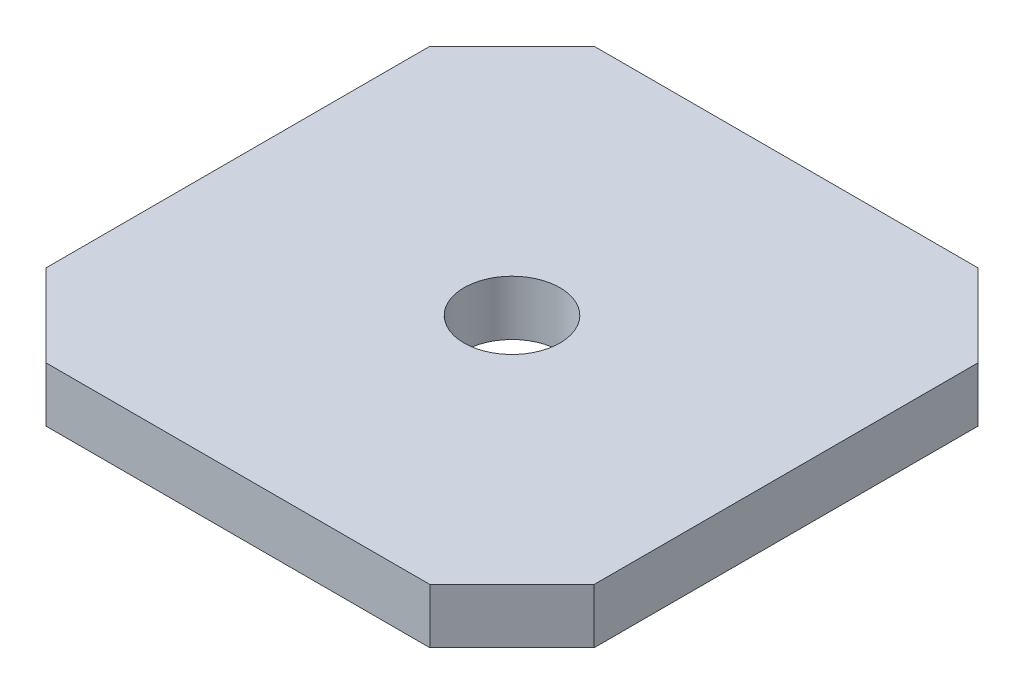
ISO-10303-21;
HEADER;
FILE_DESCRIPTION(('STEP AP214'),'2;1');
FILE_NAME('part.step','',(''),(''),'','','');
FILE_SCHEMA(('AUTOMOTIVE_DESIGN { 1 0 10303 214 1 1 1 1 }'));
ENDSEC;
DATA;
#1=APPLICATION_CONTEXT('core data for automotive mechanical design processes');
#2=APPLICATION_PROTOCOL_DEFINITION('international standard','automotive_design',2000,#1);
#3=PRODUCT_CONTEXT('',#1,'mechanical');
#4=PRODUCT('Part','Part','',(#3));
#5=PRODUCT_RELATED_PRODUCT_CATEGORY('part','',(#4));
#6=PRODUCT_DEFINITION_FORMATION('','',#4);
#7=PRODUCT_DEFINITION_CONTEXT('part definition',#1,'design');
#8=PRODUCT_DEFINITION('design','',#6,#7);
#9=PRODUCT_DEFINITION_SHAPE('','',#8);
#10=(LENGTH_UNIT() NAMED_UNIT(*) SI_UNIT(.MILLI.,.METRE.));
#11=(NAMED_UNIT(*) PLANE_ANGLE_UNIT() SI_UNIT($,.RADIAN.));
#12=(NAMED_UNIT(*) SI_UNIT($,.STERADIAN.) SOLID_ANGLE_UNIT());
#13=UNCERTAINTY_MEASURE_WITH_UNIT(LENGTH_MEASURE(1.E-05),#10,'distance_accuracy_value','');
#14=(GEOMETRIC_REPRESENTATION_CONTEXT(3) GLOBAL_UNCERTAINTY_ASSIGNED_CONTEXT((#13)) GLOBAL_UNIT_ASSIGNED_CONTEXT((#10,
#11,#12)) REPRESENTATION_CONTEXT('',''));
#15=CARTESIAN_POINT('',(0.,0.,0.));
#16=DIRECTION('',(0.,0.,1.));
#17=DIRECTION('',(1.,0.,0.));
#18=AXIS2_PLACEMENT_3D('',#15,#16,#17);
#19=CARTESIAN_POINT('',(0.,2.,0.));
#20=DIRECTION('',(0.,1.,0.));
#21=DIRECTION('',(0.,0.,1.));
#22=AXIS2_PLACEMENT_3D('',#19,#20,#21);
#23=PLANE('',#22);
#24=DIRECTION('',(-1.,0.,0.));
#25=VECTOR('',#24,1.);
#26=CARTESIAN_POINT('',(-10.,2.,-10.));
#27=LINE('',#26,#25);
#28=CARTESIAN_POINT('',(7.,2.,-10.));
#29=VERTEX_POINT('',#28);
#30=CARTESIAN_POINT('',(-7.,2.,-10.));
#31=VERTEX_POINT('',#30);
#32=EDGE_CURVE('E137',#29,#31,#27,.T.);
#33=ORIENTED_EDGE('',*,*,#32,.T.);
#34=DIRECTION('',(0.707106781186549,0.,-0.707106781186546));
#35=VECTOR('',#34,1.);
#36=CARTESIAN_POINT('',(-8.49999999999999,2.,-8.50000000000001));
#37=LINE('',#36,#35);
#38=CARTESIAN_POINT('',(-10.,2.,-7.));
#39=VERTEX_POINT('',#38);
#40=EDGE_CURVE('E156',#31,#39,#37,.F.);
#41=ORIENTED_EDGE('',*,*,#40,.T.);
#42=DIRECTION('',(0.,0.,1.));
#43=VECTOR('',#42,1.);
#44=CARTESIAN_POINT('',(-10.,2.,-10.));
#45=LINE('',#44,#43);
#46=CARTESIAN_POINT('',(-10.,2.,6.99999999999999));
#47=VERTEX_POINT('',#46);
#48=EDGE_CURVE('E120',#39,#47,#45,.T.);
#49=ORIENTED_EDGE('',*,*,#48,.T.);
#50=DIRECTION('',(-0.707106781186546,0.,-0.707106781186549));
#51=VECTOR('',#50,1.);
#52=CARTESIAN_POINT('',(-8.50000000000001,2.,8.49999999999999));
#53=LINE('',#52,#51);
#54=CARTESIAN_POINT('',(-7.,2.,10.));
#55=VERTEX_POINT('',#54);
#56=EDGE_CURVE('E151',#47,#55,#53,.F.);
#57=ORIENTED_EDGE('',*,*,#56,.T.);
#58=DIRECTION('',(1.,0.,0.));
#59=VECTOR('',#58,1.);
#60=CARTESIAN_POINT('',(-10.,2.,10.));
#61=LINE('',#60,#59);
#62=CARTESIAN_POINT('',(6.99999999999999,2.,10.));
#63=VERTEX_POINT('',#62);
#64=EDGE_CURVE('E167',#55,#63,#61,.T.);
#65=ORIENTED_EDGE('',*,*,#64,.T.);
#66=DIRECTION('',(-0.707106781186549,0.,0.707106781186546));
#67=VECTOR('',#66,1.);
#68=CARTESIAN_POINT('',(8.49999999999998,2.,8.50000000000002));
#69=LINE('',#68,#67);
#70=CARTESIAN_POINT('',(10.,2.,7.00000000000001));
#71=VERTEX_POINT('',#70);
#72=EDGE_CURVE('E56',#63,#71,#69,.F.);
#73=ORIENTED_EDGE('',*,*,#72,.T.);
#74=DIRECTION('',(0.,0.,-1.));
#75=VECTOR('',#74,1.);
#76=CARTESIAN_POINT('',(10.,2.,-10.));
#77=LINE('',#76,#75);
#78=CARTESIAN_POINT('',(10.,2.,-6.99999999999999));
#79=VERTEX_POINT('',#78);
#80=EDGE_CURVE('E175',#71,#79,#77,.T.);
#81=ORIENTED_EDGE('',*,*,#80,.T.);
#82=DIRECTION('',(0.707106781186546,0.,0.707106781186549));
#83=VECTOR('',#82,1.);
#84=CARTESIAN_POINT('',(8.50000000000001,2.,-8.49999999999998));
#85=LINE('',#84,#83);
#86=EDGE_CURVE('E154',#79,#29,#85,.F.);
#87=ORIENTED_EDGE('',*,*,#86,.T.);
#88=EDGE_LOOP('',(#33,#41,#49,#57,#65,#73,#81,#87));
#89=FACE_BOUND('',#88,.T.);
#90=CARTESIAN_POINT('',(0.,2.,0.));
#91=DIRECTION('',(0.,1.,0.));
#92=DIRECTION('',(0.,0.,1.));
#93=AXIS2_PLACEMENT_3D('',#90,#91,#92);
#94=CIRCLE('',#93,1.75);
#95=CARTESIAN_POINT('',(0.,2.,1.75));
#96=VERTEX_POINT('',#95);
#97=EDGE_CURVE('E128',#96,#96,#94,.T.);
#98=ORIENTED_EDGE('',*,*,#97,.F.);
#99=EDGE_LOOP('',(#98));
#100=FACE_BOUND('',#99,.T.);
#101=ADVANCED_FACE('F34',(#89,#100),#23,.T.);
#102=CARTESIAN_POINT('',(0.,0.,0.));
#103=DIRECTION('',(0.,1.,0.));
#104=DIRECTION('',(0.,0.,1.));
#105=AXIS2_PLACEMENT_3D('',#102,#103,#104);
#106=PLANE('',#105);
#107=DIRECTION('',(0.,0.,1.));
#108=VECTOR('',#107,1.);
#109=CARTESIAN_POINT('',(-10.,0.,-10.));
#110=LINE('',#109,#108);
#111=CARTESIAN_POINT('',(-10.,0.,-7.));
#112=VERTEX_POINT('',#111);
#113=CARTESIAN_POINT('',(-10.,0.,6.99999999999999));
#114=VERTEX_POINT('',#113);
#115=EDGE_CURVE('E117',#112,#114,#110,.T.);
#116=ORIENTED_EDGE('',*,*,#115,.F.);
#117=DIRECTION('',(-0.707106781186549,0.,0.707106781186546));
#118=VECTOR('',#117,1.);
#119=CARTESIAN_POINT('',(-10.,0.,-7.));
#120=LINE('',#119,#118);
#121=CARTESIAN_POINT('',(-6.99999999999999,0.,-10.));
#122=VERTEX_POINT('',#121);
#123=EDGE_CURVE('E100',#112,#122,#120,.F.);
#124=ORIENTED_EDGE('',*,*,#123,.T.);
#125=DIRECTION('',(-1.,0.,0.));
#126=VECTOR('',#125,1.);
#127=CARTESIAN_POINT('',(-10.,0.,-10.));
#128=LINE('',#127,#126);
#129=CARTESIAN_POINT('',(7.,0.,-10.));
#130=VERTEX_POINT('',#129);
#131=EDGE_CURVE('E141',#130,#122,#128,.T.);
#132=ORIENTED_EDGE('',*,*,#131,.F.);
#133=DIRECTION('',(-0.707106781186546,0.,-0.707106781186549));
#134=VECTOR('',#133,1.);
#135=CARTESIAN_POINT('',(7.,0.,-10.));
#136=LINE('',#135,#134);
#137=CARTESIAN_POINT('',(10.,0.,-6.99999999999999));
#138=VERTEX_POINT('',#137);
#139=EDGE_CURVE('E111',#130,#138,#136,.F.);
#140=ORIENTED_EDGE('',*,*,#139,.T.);
#141=DIRECTION('',(0.,0.,-1.));
#142=VECTOR('',#141,1.);
#143=CARTESIAN_POINT('',(10.,0.,-10.));
#144=LINE('',#143,#142);
#145=CARTESIAN_POINT('',(10.,0.,7.));
#146=VERTEX_POINT('',#145);
#147=EDGE_CURVE('E131',#146,#138,#144,.T.);
#148=ORIENTED_EDGE('',*,*,#147,.F.);
#149=DIRECTION('',(0.707106781186549,0.,-0.707106781186546));
#150=VECTOR('',#149,1.);
#151=CARTESIAN_POINT('',(10.,0.,7.));
#152=LINE('',#151,#150);
#153=CARTESIAN_POINT('',(6.99999999999999,0.,10.));
#154=VERTEX_POINT('',#153);
#155=EDGE_CURVE('E145',#146,#154,#152,.F.);
#156=ORIENTED_EDGE('',*,*,#155,.T.);
#157=DIRECTION('',(1.,0.,0.));
#158=VECTOR('',#157,1.);
#159=CARTESIAN_POINT('',(-10.,0.,10.));
#160=LINE('',#159,#158);
#161=CARTESIAN_POINT('',(-7.,0.,10.));
#162=VERTEX_POINT('',#161);
#163=EDGE_CURVE('E127',#162,#154,#160,.T.);
#164=ORIENTED_EDGE('',*,*,#163,.F.);
#165=DIRECTION('',(0.707106781186546,0.,0.707106781186549));
#166=VECTOR('',#165,1.);
#167=CARTESIAN_POINT('',(-7.,0.,10.));
#168=LINE('',#167,#166);
#169=EDGE_CURVE('E121',#162,#114,#168,.F.);
#170=ORIENTED_EDGE('',*,*,#169,.T.);
#171=EDGE_LOOP('',(#116,#124,#132,#140,#148,#156,#164,#170));
#172=FACE_BOUND('',#171,.T.);
#173=CARTESIAN_POINT('',(0.,0.,0.));
#174=DIRECTION('',(0.,1.,0.));
#175=DIRECTION('',(0.,0.,1.));
#176=AXIS2_PLACEMENT_3D('',#173,#174,#175);
#177=CIRCLE('',#176,1.75);
#178=CARTESIAN_POINT('',(0.,0.,1.75));
#179=VERTEX_POINT('',#178);
#180=EDGE_CURVE('E134',#179,#179,#177,.T.);
#181=ORIENTED_EDGE('',*,*,#180,.T.);
#182=EDGE_LOOP('',(#181));
#183=FACE_BOUND('',#182,.T.);
#184=ADVANCED_FACE('F124',(#172,#183),#106,.F.);
#185=CARTESIAN_POINT('',(-10.,2.,-10.));
#186=DIRECTION('',(1.,0.,0.));
#187=DIRECTION('',(0.,0.,-1.));
#188=AXIS2_PLACEMENT_3D('',#185,#186,#187);
#189=PLANE('',#188);
#190=ORIENTED_EDGE('',*,*,#48,.F.);
#191=DIRECTION('',(0.,-1.,0.));
#192=VECTOR('',#191,1.);
#193=CARTESIAN_POINT('',(-10.,2.,-7.));
#194=LINE('',#193,#192);
#195=EDGE_CURVE('E104',#39,#112,#194,.T.);
#196=ORIENTED_EDGE('',*,*,#195,.T.);
#197=ORIENTED_EDGE('',*,*,#115,.T.);
#198=DIRECTION('',(0.,1.,0.));
#199=VECTOR('',#198,1.);
#200=CARTESIAN_POINT('',(-10.,2.,6.99999999999999));
#201=LINE('',#200,#199);
#202=EDGE_CURVE('E122',#114,#47,#201,.T.);
#203=ORIENTED_EDGE('',*,*,#202,.T.);
#204=EDGE_LOOP('',(#190,#196,#197,#203));
#205=FACE_BOUND('',#204,.T.);
#206=ADVANCED_FACE('F116',(#205),#189,.F.);
#207=CARTESIAN_POINT('',(-10.,2.,10.));
#208=DIRECTION('',(0.,0.,-1.));
#209=DIRECTION('',(-1.,0.,0.));
#210=AXIS2_PLACEMENT_3D('',#207,#208,#209);
#211=PLANE('',#210);
#212=ORIENTED_EDGE('',*,*,#163,.T.);
#213=DIRECTION('',(0.,1.,0.));
#214=VECTOR('',#213,1.);
#215=CARTESIAN_POINT('',(6.99999999999999,2.,10.));
#216=LINE('',#215,#214);
#217=EDGE_CURVE('E11',#154,#63,#216,.T.);
#218=ORIENTED_EDGE('',*,*,#217,.T.);
#219=ORIENTED_EDGE('',*,*,#64,.F.);
#220=DIRECTION('',(0.,-1.,0.));
#221=VECTOR('',#220,1.);
#222=CARTESIAN_POINT('',(-7.,2.,10.));
#223=LINE('',#222,#221);
#224=EDGE_CURVE('E42',#55,#162,#223,.T.);
#225=ORIENTED_EDGE('',*,*,#224,.T.);
#226=EDGE_LOOP('',(#212,#218,#219,#225));
#227=FACE_BOUND('',#226,.T.);
#228=ADVANCED_FACE('F165',(#227),#211,.F.);
#229=CARTESIAN_POINT('',(10.,2.,-10.));
#230=DIRECTION('',(-1.,0.,0.));
#231=DIRECTION('',(0.,0.,1.));
#232=AXIS2_PLACEMENT_3D('',#229,#230,#231);
#233=PLANE('',#232);
#234=ORIENTED_EDGE('',*,*,#147,.T.);
#235=DIRECTION('',(0.,1.,0.));
#236=VECTOR('',#235,1.);
#237=CARTESIAN_POINT('',(10.,2.,-6.99999999999999));
#238=LINE('',#237,#236);
#239=EDGE_CURVE('E49',#138,#79,#238,.T.);
#240=ORIENTED_EDGE('',*,*,#239,.T.);
#241=ORIENTED_EDGE('',*,*,#80,.F.);
#242=DIRECTION('',(0.,-1.,0.));
#243=VECTOR('',#242,1.);
#244=CARTESIAN_POINT('',(10.,2.,7.));
#245=LINE('',#244,#243);
#246=EDGE_CURVE('E158',#71,#146,#245,.T.);
#247=ORIENTED_EDGE('',*,*,#246,.T.);
#248=EDGE_LOOP('',(#234,#240,#241,#247));
#249=FACE_BOUND('',#248,.T.);
#250=ADVANCED_FACE('F174',(#249),#233,.F.);
#251=CARTESIAN_POINT('',(-10.,2.,-10.));
#252=DIRECTION('',(0.,0.,1.));
#253=DIRECTION('',(1.,0.,0.));
#254=AXIS2_PLACEMENT_3D('',#251,#252,#253);
#255=PLANE('',#254);
#256=ORIENTED_EDGE('',*,*,#131,.T.);
#257=DIRECTION('',(0.,1.,0.));
#258=VECTOR('',#257,1.);
#259=CARTESIAN_POINT('',(-6.99999999999999,2.,-10.));
#260=LINE('',#259,#258);
#261=EDGE_CURVE('E105',#122,#31,#260,.T.);
#262=ORIENTED_EDGE('',*,*,#261,.T.);
#263=ORIENTED_EDGE('',*,*,#32,.F.);
#264=DIRECTION('',(0.,-1.,0.));
#265=VECTOR('',#264,1.);
#266=CARTESIAN_POINT('',(7.,2.,-10.));
#267=LINE('',#266,#265);
#268=EDGE_CURVE('E110',#29,#130,#267,.T.);
#269=ORIENTED_EDGE('',*,*,#268,.T.);
#270=EDGE_LOOP('',(#256,#262,#263,#269));
#271=FACE_BOUND('',#270,.T.);
#272=ADVANCED_FACE('F186',(#271),#255,.F.);
#273=CARTESIAN_POINT('',(0.,2.,0.));
#274=DIRECTION('',(0.,-1.,0.));
#275=DIRECTION('',(0.,0.,-1.));
#276=AXIS2_PLACEMENT_3D('',#273,#274,#275);
#277=CYLINDRICAL_SURFACE('',#276,1.75);
#278=ORIENTED_EDGE('',*,*,#97,.T.);
#279=EDGE_LOOP('',(#278));
#280=FACE_BOUND('',#279,.T.);
#281=ORIENTED_EDGE('',*,*,#180,.F.);
#282=EDGE_LOOP('',(#281));
#283=FACE_BOUND('',#282,.T.);
#284=ADVANCED_FACE('F184',(#280,#283),#277,.F.);
#285=CARTESIAN_POINT('',(-10.,2.,-7.));
#286=DIRECTION('',(0.707106781186546,0.,0.707106781186549));
#287=DIRECTION('',(0.,-1.,0.));
#288=AXIS2_PLACEMENT_3D('',#285,#286,#287);
#289=PLANE('',#288);
#290=ORIENTED_EDGE('',*,*,#40,.F.);
#291=ORIENTED_EDGE('',*,*,#261,.F.);
#292=ORIENTED_EDGE('',*,*,#123,.F.);
#293=ORIENTED_EDGE('',*,*,#195,.F.);
#294=EDGE_LOOP('',(#290,#291,#292,#293));
#295=FACE_BOUND('',#294,.T.);
#296=ADVANCED_FACE('F103',(#295),#289,.F.);
#297=CARTESIAN_POINT('',(7.,2.,-10.));
#298=DIRECTION('',(-0.707106781186549,0.,0.707106781186546));
#299=DIRECTION('',(0.,-1.,0.));
#300=AXIS2_PLACEMENT_3D('',#297,#298,#299);
#301=PLANE('',#300);
#302=ORIENTED_EDGE('',*,*,#86,.F.);
#303=ORIENTED_EDGE('',*,*,#239,.F.);
#304=ORIENTED_EDGE('',*,*,#139,.F.);
#305=ORIENTED_EDGE('',*,*,#268,.F.);
#306=EDGE_LOOP('',(#302,#303,#304,#305));
#307=FACE_BOUND('',#306,.T.);
#308=ADVANCED_FACE('F193',(#307),#301,.F.);
#309=CARTESIAN_POINT('',(10.,2.,7.));
#310=DIRECTION('',(-0.707106781186546,0.,-0.707106781186549));
#311=DIRECTION('',(0.,-1.,0.));
#312=AXIS2_PLACEMENT_3D('',#309,#310,#311);
#313=PLANE('',#312);
#314=ORIENTED_EDGE('',*,*,#72,.F.);
#315=ORIENTED_EDGE('',*,*,#217,.F.);
#316=ORIENTED_EDGE('',*,*,#155,.F.);
#317=ORIENTED_EDGE('',*,*,#246,.F.);
#318=EDGE_LOOP('',(#314,#315,#316,#317));
#319=FACE_BOUND('',#318,.T.);
#320=ADVANCED_FACE('F173',(#319),#313,.F.);
#321=CARTESIAN_POINT('',(-7.,2.,10.));
#322=DIRECTION('',(0.707106781186549,0.,-0.707106781186546));
#323=DIRECTION('',(0.,-1.,0.));
#324=AXIS2_PLACEMENT_3D('',#321,#322,#323);
#325=PLANE('',#324);
#326=ORIENTED_EDGE('',*,*,#56,.F.);
#327=ORIENTED_EDGE('',*,*,#202,.F.);
#328=ORIENTED_EDGE('',*,*,#169,.F.);
#329=ORIENTED_EDGE('',*,*,#224,.F.);
#330=EDGE_LOOP('',(#326,#327,#328,#329));
#331=FACE_BOUND('',#330,.T.);
#332=ADVANCED_FACE('F36',(#331),#325,.F.);
#333=CLOSED_SHELL('',(#101,#184,#206,#228,#250,#272,#284,#296,#308,#320,#332));
#334=MANIFOLD_SOLID_BREP('B2',#333);
#335=ADVANCED_BREP_SHAPE_REPRESENTATION('',(#18,#334),#14);
#336=SHAPE_DEFINITION_REPRESENTATION(#9,#335);
ENDSEC;
END-ISO-10303-21;
